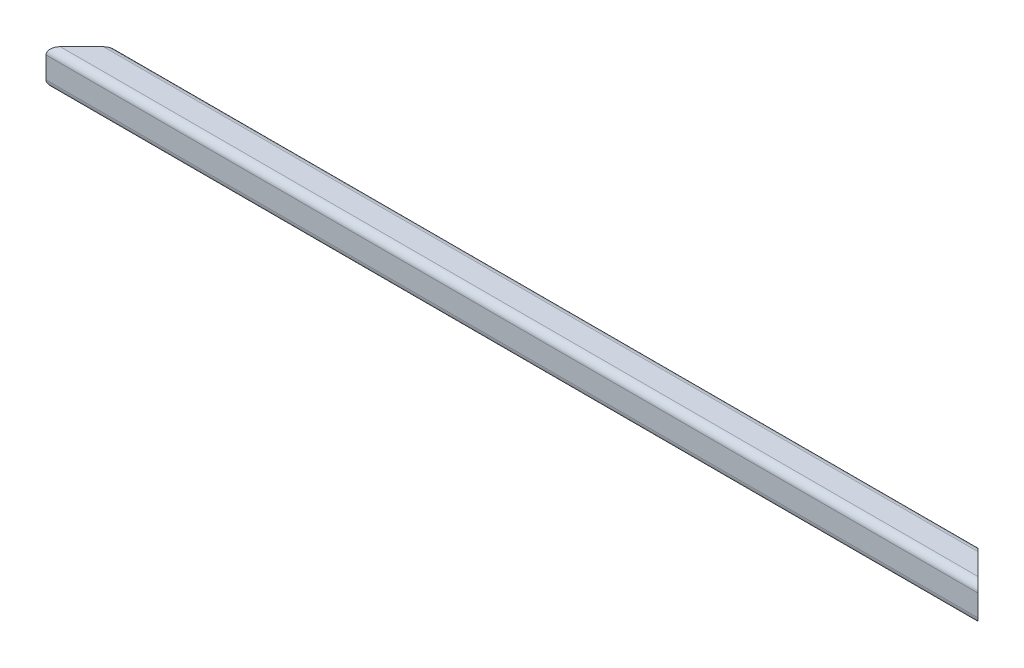
ISO-10303-21;
HEADER;
FILE_DESCRIPTION(('STEP AP214'),'2;1');
FILE_NAME('part.step','',(''),(''),'','','');
FILE_SCHEMA(('AUTOMOTIVE_DESIGN { 1 0 10303 214 1 1 1 1 }'));
ENDSEC;
DATA;
#1=APPLICATION_CONTEXT('core data for automotive mechanical design processes');
#2=APPLICATION_PROTOCOL_DEFINITION('international standard','automotive_design',2000,#1);
#3=PRODUCT_CONTEXT('',#1,'mechanical');
#4=PRODUCT('Part','Part','',(#3));
#5=PRODUCT_RELATED_PRODUCT_CATEGORY('part','',(#4));
#6=PRODUCT_DEFINITION_FORMATION('','',#4);
#7=PRODUCT_DEFINITION_CONTEXT('part definition',#1,'design');
#8=PRODUCT_DEFINITION('design','',#6,#7);
#9=PRODUCT_DEFINITION_SHAPE('','',#8);
#10=(LENGTH_UNIT() NAMED_UNIT(*) SI_UNIT(.MILLI.,.METRE.));
#11=(NAMED_UNIT(*) PLANE_ANGLE_UNIT() SI_UNIT($,.RADIAN.));
#12=(NAMED_UNIT(*) SI_UNIT($,.STERADIAN.) SOLID_ANGLE_UNIT());
#13=UNCERTAINTY_MEASURE_WITH_UNIT(LENGTH_MEASURE(1.E-05),#10,'distance_accuracy_value','');
#14=(GEOMETRIC_REPRESENTATION_CONTEXT(3) GLOBAL_UNCERTAINTY_ASSIGNED_CONTEXT((#13)) GLOBAL_UNIT_ASSIGNED_CONTEXT((#10,
#11,#12)) REPRESENTATION_CONTEXT('',''));
#15=CARTESIAN_POINT('',(0.,0.,0.));
#16=DIRECTION('',(0.,0.,1.));
#17=DIRECTION('',(1.,0.,0.));
#18=AXIS2_PLACEMENT_3D('',#15,#16,#17);
#19=CARTESIAN_POINT('',(-250.,226.,-1994.));
#20=DIRECTION('',(1.,0.,0.));
#21=DIRECTION('',(0.,0.,-1.));
#22=AXIS2_PLACEMENT_3D('',#19,#20,#21);
#23=CYLINDRICAL_SURFACE('',#22,4.);
#24=CARTESIAN_POINT('',(256.,226.,-1994.));
#25=DIRECTION('',(0.707106781186548,0.,-0.707106781186547));
#26=DIRECTION('',(0.707106781186547,0.,0.707106781186548));
#27=AXIS2_PLACEMENT_3D('',#24,#25,#26);
#28=ELLIPSE('',#27,5.65685424949238,4.);
#29=CARTESIAN_POINT('',(256.,230.,-1994.));
#30=VERTEX_POINT('',#29);
#31=CARTESIAN_POINT('',(260.,226.,-1990.));
#32=VERTEX_POINT('',#31);
#33=EDGE_CURVE('E185',#30,#32,#28,.T.);
#34=ORIENTED_EDGE('',*,*,#33,.F.);
#35=DIRECTION('',(1.,0.,0.));
#36=VECTOR('',#35,1.);
#37=CARTESIAN_POINT('',(-250.,230.,-1994.));
#38=LINE('',#37,#36);
#39=CARTESIAN_POINT('',(-256.,230.,-1994.));
#40=VERTEX_POINT('',#39);
#41=EDGE_CURVE('E265',#40,#30,#38,.T.);
#42=ORIENTED_EDGE('',*,*,#41,.F.);
#43=CARTESIAN_POINT('',(-256.,226.,-1994.));
#44=DIRECTION('',(-0.707106781186548,0.,-0.707106781186547));
#45=DIRECTION('',(0.707106781186547,0.,-0.707106781186548));
#46=AXIS2_PLACEMENT_3D('',#43,#44,#45);
#47=ELLIPSE('',#46,5.65685424949238,4.);
#48=CARTESIAN_POINT('',(-260.,226.,-1990.));
#49=VERTEX_POINT('',#48);
#50=EDGE_CURVE('E176',#49,#40,#47,.T.);
#51=ORIENTED_EDGE('',*,*,#50,.F.);
#52=DIRECTION('',(1.,0.,0.));
#53=VECTOR('',#52,1.);
#54=CARTESIAN_POINT('',(-250.,226.,-1990.));
#55=LINE('',#54,#53);
#56=EDGE_CURVE('E45',#49,#32,#55,.T.);
#57=ORIENTED_EDGE('',*,*,#56,.T.);
#58=EDGE_LOOP('',(#34,#42,#51,#57));
#59=FACE_BOUND('',#58,.T.);
#60=ADVANCED_FACE('F41',(#59),#23,.T.);
#61=CARTESIAN_POINT('',(-250.,230.,-1994.));
#62=DIRECTION('',(0.,-1.,0.));
#63=DIRECTION('',(0.,0.,-1.));
#64=AXIS2_PLACEMENT_3D('',#61,#62,#63);
#65=PLANE('',#64);
#66=DIRECTION('',(0.707106781186547,0.,0.707106781186548));
#67=VECTOR('',#66,1.);
#68=CARTESIAN_POINT('',(2.99999999999995,230.,-2247.));
#69=LINE('',#68,#67);
#70=CARTESIAN_POINT('',(244.,230.,-2006.));
#71=VERTEX_POINT('',#70);
#72=EDGE_CURVE('E182',#71,#30,#69,.T.);
#73=ORIENTED_EDGE('',*,*,#72,.F.);
#74=DIRECTION('',(1.,0.,0.));
#75=VECTOR('',#74,1.);
#76=CARTESIAN_POINT('',(-250.,230.,-2006.));
#77=LINE('',#76,#75);
#78=CARTESIAN_POINT('',(-244.,230.,-2006.));
#79=VERTEX_POINT('',#78);
#80=EDGE_CURVE('E263',#79,#71,#77,.T.);
#81=ORIENTED_EDGE('',*,*,#80,.F.);
#82=DIRECTION('',(0.707106781186547,0.,-0.707106781186548));
#83=VECTOR('',#82,1.);
#84=CARTESIAN_POINT('',(-253.,230.,-1997.));
#85=LINE('',#84,#83);
#86=EDGE_CURVE('E281',#40,#79,#85,.T.);
#87=ORIENTED_EDGE('',*,*,#86,.F.);
#88=ORIENTED_EDGE('',*,*,#41,.T.);
#89=EDGE_LOOP('',(#73,#81,#87,#88));
#90=FACE_BOUND('',#89,.T.);
#91=ADVANCED_FACE('F272',(#90),#65,.F.);
#92=CARTESIAN_POINT('',(-250.,226.,-2006.));
#93=DIRECTION('',(1.,0.,0.));
#94=DIRECTION('',(0.,0.,-1.));
#95=AXIS2_PLACEMENT_3D('',#92,#93,#94);
#96=CYLINDRICAL_SURFACE('',#95,4.);
#97=CARTESIAN_POINT('',(244.,226.,-2006.));
#98=DIRECTION('',(0.707106781186548,0.,-0.707106781186547));
#99=DIRECTION('',(0.707106781186547,0.,0.707106781186548));
#100=AXIS2_PLACEMENT_3D('',#97,#98,#99);
#101=ELLIPSE('',#100,5.65685424949238,4.);
#102=CARTESIAN_POINT('',(240.,226.,-2010.));
#103=VERTEX_POINT('',#102);
#104=EDGE_CURVE('E11',#103,#71,#101,.T.);
#105=ORIENTED_EDGE('',*,*,#104,.F.);
#106=DIRECTION('',(1.,0.,0.));
#107=VECTOR('',#106,1.);
#108=CARTESIAN_POINT('',(-250.,226.,-2010.));
#109=LINE('',#108,#107);
#110=CARTESIAN_POINT('',(-240.,226.,-2010.));
#111=VERTEX_POINT('',#110);
#112=EDGE_CURVE('E260',#111,#103,#109,.T.);
#113=ORIENTED_EDGE('',*,*,#112,.F.);
#114=CARTESIAN_POINT('',(-244.,226.,-2006.));
#115=DIRECTION('',(-0.707106781186548,0.,-0.707106781186547));
#116=DIRECTION('',(0.707106781186547,0.,-0.707106781186548));
#117=AXIS2_PLACEMENT_3D('',#114,#115,#116);
#118=ELLIPSE('',#117,5.65685424949238,4.);
#119=EDGE_CURVE('E278',#79,#111,#118,.T.);
#120=ORIENTED_EDGE('',*,*,#119,.F.);
#121=ORIENTED_EDGE('',*,*,#80,.T.);
#122=EDGE_LOOP('',(#105,#113,#120,#121));
#123=FACE_BOUND('',#122,.T.);
#124=ADVANCED_FACE('F275',(#123),#96,.T.);
#125=CARTESIAN_POINT('',(-250.,214.,-2010.));
#126=DIRECTION('',(0.,0.,1.));
#127=DIRECTION('',(1.,0.,0.));
#128=AXIS2_PLACEMENT_3D('',#125,#126,#127);
#129=PLANE('',#128);
#130=DIRECTION('',(0.,1.,0.));
#131=VECTOR('',#130,1.);
#132=CARTESIAN_POINT('',(240.,214.,-2010.));
#133=LINE('',#132,#131);
#134=CARTESIAN_POINT('',(240.,214.,-2010.));
#135=VERTEX_POINT('',#134);
#136=EDGE_CURVE('E51',#135,#103,#133,.T.);
#137=ORIENTED_EDGE('',*,*,#136,.F.);
#138=DIRECTION('',(1.,0.,0.));
#139=VECTOR('',#138,1.);
#140=CARTESIAN_POINT('',(-250.,214.,-2010.));
#141=LINE('',#140,#139);
#142=CARTESIAN_POINT('',(-240.,214.,-2010.));
#143=VERTEX_POINT('',#142);
#144=EDGE_CURVE('E257',#143,#135,#141,.T.);
#145=ORIENTED_EDGE('',*,*,#144,.F.);
#146=DIRECTION('',(0.,-1.,0.));
#147=VECTOR('',#146,1.);
#148=CARTESIAN_POINT('',(-240.,214.,-2010.));
#149=LINE('',#148,#147);
#150=EDGE_CURVE('E280',#111,#143,#149,.T.);
#151=ORIENTED_EDGE('',*,*,#150,.F.);
#152=ORIENTED_EDGE('',*,*,#112,.T.);
#153=EDGE_LOOP('',(#137,#145,#151,#152));
#154=FACE_BOUND('',#153,.T.);
#155=ADVANCED_FACE('F291',(#154),#129,.F.);
#156=CARTESIAN_POINT('',(-250.,214.,-2006.));
#157=DIRECTION('',(1.,0.,0.));
#158=DIRECTION('',(0.,0.,-1.));
#159=AXIS2_PLACEMENT_3D('',#156,#157,#158);
#160=CYLINDRICAL_SURFACE('',#159,4.);
#161=CARTESIAN_POINT('',(244.,214.,-2006.));
#162=DIRECTION('',(0.707106781186548,0.,-0.707106781186547));
#163=DIRECTION('',(0.707106781186547,0.,0.707106781186548));
#164=AXIS2_PLACEMENT_3D('',#161,#162,#163);
#165=ELLIPSE('',#164,5.65685424949238,4.);
#166=CARTESIAN_POINT('',(244.,210.,-2006.));
#167=VERTEX_POINT('',#166);
#168=EDGE_CURVE('E200',#167,#135,#165,.T.);
#169=ORIENTED_EDGE('',*,*,#168,.F.);
#170=DIRECTION('',(1.,0.,0.));
#171=VECTOR('',#170,1.);
#172=CARTESIAN_POINT('',(-250.,210.,-2006.));
#173=LINE('',#172,#171);
#174=CARTESIAN_POINT('',(-244.,210.,-2006.));
#175=VERTEX_POINT('',#174);
#176=EDGE_CURVE('E254',#175,#167,#173,.T.);
#177=ORIENTED_EDGE('',*,*,#176,.F.);
#178=CARTESIAN_POINT('',(-244.,214.,-2006.));
#179=DIRECTION('',(-0.707106781186548,0.,-0.707106781186547));
#180=DIRECTION('',(0.707106781186547,0.,-0.707106781186548));
#181=AXIS2_PLACEMENT_3D('',#178,#179,#180);
#182=ELLIPSE('',#181,5.65685424949238,4.);
#183=EDGE_CURVE('E187',#143,#175,#182,.T.);
#184=ORIENTED_EDGE('',*,*,#183,.F.);
#185=ORIENTED_EDGE('',*,*,#144,.T.);
#186=EDGE_LOOP('',(#169,#177,#184,#185));
#187=FACE_BOUND('',#186,.T.);
#188=ADVANCED_FACE('F289',(#187),#160,.T.);
#189=CARTESIAN_POINT('',(-250.,210.,-2006.));
#190=DIRECTION('',(0.,1.,0.));
#191=DIRECTION('',(0.,0.,1.));
#192=AXIS2_PLACEMENT_3D('',#189,#190,#191);
#193=PLANE('',#192);
#194=DIRECTION('',(-0.707106781186547,0.,-0.707106781186548));
#195=VECTOR('',#194,1.);
#196=CARTESIAN_POINT('',(-3.00000000000009,210.,-2253.));
#197=LINE('',#196,#195);
#198=CARTESIAN_POINT('',(256.,210.,-1994.));
#199=VERTEX_POINT('',#198);
#200=EDGE_CURVE('E203',#199,#167,#197,.T.);
#201=ORIENTED_EDGE('',*,*,#200,.F.);
#202=DIRECTION('',(1.,0.,0.));
#203=VECTOR('',#202,1.);
#204=CARTESIAN_POINT('',(-250.,210.,-1994.));
#205=LINE('',#204,#203);
#206=CARTESIAN_POINT('',(-256.,210.,-1994.));
#207=VERTEX_POINT('',#206);
#208=EDGE_CURVE('E252',#207,#199,#205,.T.);
#209=ORIENTED_EDGE('',*,*,#208,.F.);
#210=DIRECTION('',(-0.707106781186547,0.,0.707106781186548));
#211=VECTOR('',#210,1.);
#212=CARTESIAN_POINT('',(-247.,210.,-2003.));
#213=LINE('',#212,#211);
#214=EDGE_CURVE('E181',#175,#207,#213,.T.);
#215=ORIENTED_EDGE('',*,*,#214,.F.);
#216=ORIENTED_EDGE('',*,*,#176,.T.);
#217=EDGE_LOOP('',(#201,#209,#215,#216));
#218=FACE_BOUND('',#217,.T.);
#219=ADVANCED_FACE('F293',(#218),#193,.F.);
#220=CARTESIAN_POINT('',(-250.,214.,-1994.));
#221=DIRECTION('',(1.,0.,0.));
#222=DIRECTION('',(0.,0.,-1.));
#223=AXIS2_PLACEMENT_3D('',#220,#221,#222);
#224=CYLINDRICAL_SURFACE('',#223,4.);
#225=CARTESIAN_POINT('',(256.,214.,-1994.));
#226=DIRECTION('',(0.707106781186548,0.,-0.707106781186547));
#227=DIRECTION('',(0.707106781186547,0.,0.707106781186548));
#228=AXIS2_PLACEMENT_3D('',#225,#226,#227);
#229=ELLIPSE('',#228,5.65685424949238,4.);
#230=CARTESIAN_POINT('',(260.,214.,-1990.));
#231=VERTEX_POINT('',#230);
#232=EDGE_CURVE('E164',#231,#199,#229,.T.);
#233=ORIENTED_EDGE('',*,*,#232,.F.);
#234=DIRECTION('',(1.,0.,0.));
#235=VECTOR('',#234,1.);
#236=CARTESIAN_POINT('',(-250.,214.,-1990.));
#237=LINE('',#236,#235);
#238=CARTESIAN_POINT('',(-260.,214.,-1990.));
#239=VERTEX_POINT('',#238);
#240=EDGE_CURVE('E156',#239,#231,#237,.T.);
#241=ORIENTED_EDGE('',*,*,#240,.F.);
#242=CARTESIAN_POINT('',(-256.,214.,-1994.));
#243=DIRECTION('',(-0.707106781186548,0.,-0.707106781186547));
#244=DIRECTION('',(0.707106781186547,0.,-0.707106781186548));
#245=AXIS2_PLACEMENT_3D('',#242,#243,#244);
#246=ELLIPSE('',#245,5.65685424949238,4.);
#247=EDGE_CURVE('E161',#207,#239,#246,.T.);
#248=ORIENTED_EDGE('',*,*,#247,.F.);
#249=ORIENTED_EDGE('',*,*,#208,.T.);
#250=EDGE_LOOP('',(#233,#241,#248,#249));
#251=FACE_BOUND('',#250,.T.);
#252=ADVANCED_FACE('F158',(#251),#224,.T.);
#253=CARTESIAN_POINT('',(-250.,226.,-2006.));
#254=DIRECTION('',(1.,0.,0.));
#255=DIRECTION('',(0.,0.,-1.));
#256=AXIS2_PLACEMENT_3D('',#253,#254,#255);
#257=CYLINDRICAL_SURFACE('',#256,2.);
#258=DIRECTION('',(1.,0.,0.));
#259=VECTOR('',#258,1.);
#260=CARTESIAN_POINT('',(-250.,226.,-2008.));
#261=LINE('',#260,#259);
#262=CARTESIAN_POINT('',(-242.,226.,-2008.));
#263=VERTEX_POINT('',#262);
#264=CARTESIAN_POINT('',(242.,226.,-2008.));
#265=VERTEX_POINT('',#264);
#266=EDGE_CURVE('E209',#263,#265,#261,.T.);
#267=ORIENTED_EDGE('',*,*,#266,.T.);
#268=CARTESIAN_POINT('',(244.,226.,-2006.));
#269=DIRECTION('',(0.707106781186548,0.,-0.707106781186547));
#270=DIRECTION('',(0.707106781186547,0.,0.707106781186548));
#271=AXIS2_PLACEMENT_3D('',#268,#269,#270);
#272=ELLIPSE('',#271,2.82842712474619,2.);
#273=CARTESIAN_POINT('',(243.999999999999,228.,-2006.));
#274=VERTEX_POINT('',#273);
#275=EDGE_CURVE('E87',#265,#274,#272,.T.);
#276=ORIENTED_EDGE('',*,*,#275,.T.);
#277=DIRECTION('',(1.,0.,0.));
#278=VECTOR('',#277,1.);
#279=CARTESIAN_POINT('',(-250.,228.,-2006.));
#280=LINE('',#279,#278);
#281=CARTESIAN_POINT('',(-244.,228.,-2006.));
#282=VERTEX_POINT('',#281);
#283=EDGE_CURVE('E212',#282,#274,#280,.T.);
#284=ORIENTED_EDGE('',*,*,#283,.F.);
#285=CARTESIAN_POINT('',(-244.,226.,-2006.));
#286=DIRECTION('',(-0.707106781186548,0.,-0.707106781186547));
#287=DIRECTION('',(0.707106781186547,0.,-0.707106781186548));
#288=AXIS2_PLACEMENT_3D('',#285,#286,#287);
#289=ELLIPSE('',#288,2.82842712474619,2.);
#290=EDGE_CURVE('E208',#282,#263,#289,.T.);
#291=ORIENTED_EDGE('',*,*,#290,.T.);
#292=EDGE_LOOP('',(#267,#276,#284,#291));
#293=FACE_BOUND('',#292,.T.);
#294=ADVANCED_FACE('F301',(#293),#257,.F.);
#295=CARTESIAN_POINT('',(-250.,228.,-1994.));
#296=DIRECTION('',(0.,-1.,0.));
#297=DIRECTION('',(0.,0.,-1.));
#298=AXIS2_PLACEMENT_3D('',#295,#296,#297);
#299=PLANE('',#298);
#300=ORIENTED_EDGE('',*,*,#283,.T.);
#301=DIRECTION('',(0.707106781186547,0.,0.707106781186548));
#302=VECTOR('',#301,1.);
#303=CARTESIAN_POINT('',(2.99999999999995,228.,-2247.));
#304=LINE('',#303,#302);
#305=CARTESIAN_POINT('',(256.,228.,-1994.));
#306=VERTEX_POINT('',#305);
#307=EDGE_CURVE('E60',#274,#306,#304,.T.);
#308=ORIENTED_EDGE('',*,*,#307,.T.);
#309=DIRECTION('',(1.,0.,0.));
#310=VECTOR('',#309,1.);
#311=CARTESIAN_POINT('',(-250.,228.,-1994.));
#312=LINE('',#311,#310);
#313=CARTESIAN_POINT('',(-256.,228.,-1994.));
#314=VERTEX_POINT('',#313);
#315=EDGE_CURVE('E217',#314,#306,#312,.T.);
#316=ORIENTED_EDGE('',*,*,#315,.F.);
#317=DIRECTION('',(0.707106781186547,0.,-0.707106781186548));
#318=VECTOR('',#317,1.);
#319=CARTESIAN_POINT('',(-253.,228.,-1997.));
#320=LINE('',#319,#318);
#321=EDGE_CURVE('E211',#314,#282,#320,.T.);
#322=ORIENTED_EDGE('',*,*,#321,.T.);
#323=EDGE_LOOP('',(#300,#308,#316,#322));
#324=FACE_BOUND('',#323,.T.);
#325=ADVANCED_FACE('F349',(#324),#299,.T.);
#326=CARTESIAN_POINT('',(-250.,226.,-1994.));
#327=DIRECTION('',(1.,0.,0.));
#328=DIRECTION('',(0.,0.,-1.));
#329=AXIS2_PLACEMENT_3D('',#326,#327,#328);
#330=CYLINDRICAL_SURFACE('',#329,2.);
#331=ORIENTED_EDGE('',*,*,#315,.T.);
#332=CARTESIAN_POINT('',(256.,226.,-1994.));
#333=DIRECTION('',(0.707106781186548,0.,-0.707106781186547));
#334=DIRECTION('',(0.707106781186547,0.,0.707106781186548));
#335=AXIS2_PLACEMENT_3D('',#332,#333,#334);
#336=ELLIPSE('',#335,2.82842712474619,2.);
#337=CARTESIAN_POINT('',(258.,226.,-1992.));
#338=VERTEX_POINT('',#337);
#339=EDGE_CURVE('E213',#306,#338,#336,.T.);
#340=ORIENTED_EDGE('',*,*,#339,.T.);
#341=DIRECTION('',(1.,0.,0.));
#342=VECTOR('',#341,1.);
#343=CARTESIAN_POINT('',(-250.,226.,-1992.));
#344=LINE('',#343,#342);
#345=CARTESIAN_POINT('',(-258.,226.,-1992.));
#346=VERTEX_POINT('',#345);
#347=EDGE_CURVE('E222',#346,#338,#344,.T.);
#348=ORIENTED_EDGE('',*,*,#347,.F.);
#349=CARTESIAN_POINT('',(-256.,226.,-1994.));
#350=DIRECTION('',(-0.707106781186548,0.,-0.707106781186547));
#351=DIRECTION('',(0.707106781186547,0.,-0.707106781186548));
#352=AXIS2_PLACEMENT_3D('',#349,#350,#351);
#353=ELLIPSE('',#352,2.82842712474619,2.);
#354=EDGE_CURVE('E216',#346,#314,#353,.T.);
#355=ORIENTED_EDGE('',*,*,#354,.T.);
#356=EDGE_LOOP('',(#331,#340,#348,#355));
#357=FACE_BOUND('',#356,.T.);
#358=ADVANCED_FACE('F357',(#357),#330,.F.);
#359=CARTESIAN_POINT('',(-250.,226.,-1992.));
#360=DIRECTION('',(0.,0.,-1.));
#361=DIRECTION('',(-1.,0.,0.));
#362=AXIS2_PLACEMENT_3D('',#359,#360,#361);
#363=PLANE('',#362);
#364=ORIENTED_EDGE('',*,*,#347,.T.);
#365=DIRECTION('',(0.,-1.,0.));
#366=VECTOR('',#365,1.);
#367=CARTESIAN_POINT('',(258.,226.,-1992.));
#368=LINE('',#367,#366);
#369=CARTESIAN_POINT('',(258.,214.,-1992.));
#370=VERTEX_POINT('',#369);
#371=EDGE_CURVE('E218',#338,#370,#368,.T.);
#372=ORIENTED_EDGE('',*,*,#371,.T.);
#373=DIRECTION('',(1.,0.,0.));
#374=VECTOR('',#373,1.);
#375=CARTESIAN_POINT('',(-250.,214.,-1992.));
#376=LINE('',#375,#374);
#377=CARTESIAN_POINT('',(-258.,214.,-1992.));
#378=VERTEX_POINT('',#377);
#379=EDGE_CURVE('E227',#378,#370,#376,.T.);
#380=ORIENTED_EDGE('',*,*,#379,.F.);
#381=DIRECTION('',(0.,1.,0.));
#382=VECTOR('',#381,1.);
#383=CARTESIAN_POINT('',(-258.,226.,-1992.));
#384=LINE('',#383,#382);
#385=EDGE_CURVE('E221',#378,#346,#384,.T.);
#386=ORIENTED_EDGE('',*,*,#385,.T.);
#387=EDGE_LOOP('',(#364,#372,#380,#386));
#388=FACE_BOUND('',#387,.T.);
#389=ADVANCED_FACE('F365',(#388),#363,.T.);
#390=CARTESIAN_POINT('',(-250.,214.,-1994.));
#391=DIRECTION('',(1.,0.,0.));
#392=DIRECTION('',(0.,0.,-1.));
#393=AXIS2_PLACEMENT_3D('',#390,#391,#392);
#394=CYLINDRICAL_SURFACE('',#393,2.);
#395=ORIENTED_EDGE('',*,*,#379,.T.);
#396=CARTESIAN_POINT('',(256.,214.,-1994.));
#397=DIRECTION('',(0.707106781186548,0.,-0.707106781186547));
#398=DIRECTION('',(0.707106781186547,0.,0.707106781186548));
#399=AXIS2_PLACEMENT_3D('',#396,#397,#398);
#400=ELLIPSE('',#399,2.82842712474619,2.);
#401=CARTESIAN_POINT('',(256.,212.,-1994.));
#402=VERTEX_POINT('',#401);
#403=EDGE_CURVE('E223',#370,#402,#400,.T.);
#404=ORIENTED_EDGE('',*,*,#403,.T.);
#405=DIRECTION('',(1.,0.,0.));
#406=VECTOR('',#405,1.);
#407=CARTESIAN_POINT('',(-250.,212.,-1994.));
#408=LINE('',#407,#406);
#409=CARTESIAN_POINT('',(-256.,212.,-1994.));
#410=VERTEX_POINT('',#409);
#411=EDGE_CURVE('E232',#410,#402,#408,.T.);
#412=ORIENTED_EDGE('',*,*,#411,.F.);
#413=CARTESIAN_POINT('',(-256.,214.,-1994.));
#414=DIRECTION('',(-0.707106781186548,0.,-0.707106781186547));
#415=DIRECTION('',(0.707106781186547,0.,-0.707106781186548));
#416=AXIS2_PLACEMENT_3D('',#413,#414,#415);
#417=ELLIPSE('',#416,2.82842712474619,2.);
#418=EDGE_CURVE('E226',#410,#378,#417,.T.);
#419=ORIENTED_EDGE('',*,*,#418,.T.);
#420=EDGE_LOOP('',(#395,#404,#412,#419));
#421=FACE_BOUND('',#420,.T.);
#422=ADVANCED_FACE('F373',(#421),#394,.F.);
#423=CARTESIAN_POINT('',(-250.,212.,-2006.));
#424=DIRECTION('',(0.,1.,0.));
#425=DIRECTION('',(0.,0.,1.));
#426=AXIS2_PLACEMENT_3D('',#423,#424,#425);
#427=PLANE('',#426);
#428=ORIENTED_EDGE('',*,*,#411,.T.);
#429=DIRECTION('',(-0.707106781186547,0.,-0.707106781186548));
#430=VECTOR('',#429,1.);
#431=CARTESIAN_POINT('',(-3.00000000000009,212.,-2253.));
#432=LINE('',#431,#430);
#433=CARTESIAN_POINT('',(244.,212.,-2006.));
#434=VERTEX_POINT('',#433);
#435=EDGE_CURVE('E228',#402,#434,#432,.T.);
#436=ORIENTED_EDGE('',*,*,#435,.T.);
#437=DIRECTION('',(1.,0.,0.));
#438=VECTOR('',#437,1.);
#439=CARTESIAN_POINT('',(-250.,212.,-2006.));
#440=LINE('',#439,#438);
#441=CARTESIAN_POINT('',(-244.,212.,-2006.));
#442=VERTEX_POINT('',#441);
#443=EDGE_CURVE('E236',#442,#434,#440,.T.);
#444=ORIENTED_EDGE('',*,*,#443,.F.);
#445=DIRECTION('',(-0.707106781186547,0.,0.707106781186548));
#446=VECTOR('',#445,1.);
#447=CARTESIAN_POINT('',(-247.,212.,-2003.));
#448=LINE('',#447,#446);
#449=EDGE_CURVE('E231',#442,#410,#448,.T.);
#450=ORIENTED_EDGE('',*,*,#449,.T.);
#451=EDGE_LOOP('',(#428,#436,#444,#450));
#452=FACE_BOUND('',#451,.T.);
#453=ADVANCED_FACE('F381',(#452),#427,.T.);
#454=CARTESIAN_POINT('',(-250.,214.,-2006.));
#455=DIRECTION('',(1.,0.,0.));
#456=DIRECTION('',(0.,0.,-1.));
#457=AXIS2_PLACEMENT_3D('',#454,#455,#456);
#458=CYLINDRICAL_SURFACE('',#457,2.);
#459=ORIENTED_EDGE('',*,*,#443,.T.);
#460=CARTESIAN_POINT('',(244.,214.,-2006.));
#461=DIRECTION('',(0.707106781186548,0.,-0.707106781186547));
#462=DIRECTION('',(0.707106781186547,0.,0.707106781186548));
#463=AXIS2_PLACEMENT_3D('',#460,#461,#462);
#464=ELLIPSE('',#463,2.82842712474619,2.);
#465=CARTESIAN_POINT('',(242.,214.,-2008.));
#466=VERTEX_POINT('',#465);
#467=EDGE_CURVE('E233',#434,#466,#464,.T.);
#468=ORIENTED_EDGE('',*,*,#467,.T.);
#469=DIRECTION('',(1.,0.,0.));
#470=VECTOR('',#469,1.);
#471=CARTESIAN_POINT('',(-250.,214.,-2008.));
#472=LINE('',#471,#470);
#473=CARTESIAN_POINT('',(-242.,214.,-2008.));
#474=VERTEX_POINT('',#473);
#475=EDGE_CURVE('E194',#474,#466,#472,.T.);
#476=ORIENTED_EDGE('',*,*,#475,.F.);
#477=CARTESIAN_POINT('',(-244.,214.,-2006.));
#478=DIRECTION('',(-0.707106781186548,0.,-0.707106781186547));
#479=DIRECTION('',(0.707106781186547,0.,-0.707106781186548));
#480=AXIS2_PLACEMENT_3D('',#477,#478,#479);
#481=ELLIPSE('',#480,2.82842712474619,2.);
#482=EDGE_CURVE('E235',#474,#442,#481,.T.);
#483=ORIENTED_EDGE('',*,*,#482,.T.);
#484=EDGE_LOOP('',(#459,#468,#476,#483));
#485=FACE_BOUND('',#484,.T.);
#486=ADVANCED_FACE('F389',(#485),#458,.F.);
#487=CARTESIAN_POINT('',(-250.,214.,-2008.));
#488=DIRECTION('',(0.,0.,1.));
#489=DIRECTION('',(1.,0.,0.));
#490=AXIS2_PLACEMENT_3D('',#487,#488,#489);
#491=PLANE('',#490);
#492=ORIENTED_EDGE('',*,*,#475,.T.);
#493=DIRECTION('',(0.,1.,0.));
#494=VECTOR('',#493,1.);
#495=CARTESIAN_POINT('',(242.,214.,-2008.));
#496=LINE('',#495,#494);
#497=EDGE_CURVE('E82',#466,#265,#496,.T.);
#498=ORIENTED_EDGE('',*,*,#497,.T.);
#499=ORIENTED_EDGE('',*,*,#266,.F.);
#500=DIRECTION('',(0.,-1.,0.));
#501=VECTOR('',#500,1.);
#502=CARTESIAN_POINT('',(-242.,214.,-2008.));
#503=LINE('',#502,#501);
#504=EDGE_CURVE('E169',#263,#474,#503,.T.);
#505=ORIENTED_EDGE('',*,*,#504,.T.);
#506=EDGE_LOOP('',(#492,#498,#499,#505));
#507=FACE_BOUND('',#506,.T.);
#508=ADVANCED_FACE('F397',(#507),#491,.T.);
#509=CARTESIAN_POINT('',(-250.,226.,-1990.));
#510=DIRECTION('',(0.,0.,-1.));
#511=DIRECTION('',(-1.,0.,0.));
#512=AXIS2_PLACEMENT_3D('',#509,#510,#511);
#513=PLANE('',#512);
#514=DIRECTION('',(0.,-1.,0.));
#515=VECTOR('',#514,1.);
#516=CARTESIAN_POINT('',(260.,226.,-1990.));
#517=LINE('',#516,#515);
#518=EDGE_CURVE('E196',#32,#231,#517,.T.);
#519=ORIENTED_EDGE('',*,*,#518,.F.);
#520=ORIENTED_EDGE('',*,*,#56,.F.);
#521=DIRECTION('',(0.,1.,0.));
#522=VECTOR('',#521,1.);
#523=CARTESIAN_POINT('',(-260.,226.,-1990.));
#524=LINE('',#523,#522);
#525=EDGE_CURVE('E168',#239,#49,#524,.T.);
#526=ORIENTED_EDGE('',*,*,#525,.F.);
#527=ORIENTED_EDGE('',*,*,#240,.T.);
#528=EDGE_LOOP('',(#519,#520,#526,#527));
#529=FACE_BOUND('',#528,.T.);
#530=ADVANCED_FACE('F172',(#529),#513,.F.);
#531=CARTESIAN_POINT('',(-250.,220.,-2000.));
#532=DIRECTION('',(-0.707106781186548,0.,-0.707106781186547));
#533=DIRECTION('',(-0.707106781186547,0.,0.707106781186548));
#534=AXIS2_PLACEMENT_3D('',#531,#532,#533);
#535=PLANE('',#534);
#536=ORIENTED_EDGE('',*,*,#290,.F.);
#537=ORIENTED_EDGE('',*,*,#321,.F.);
#538=ORIENTED_EDGE('',*,*,#354,.F.);
#539=ORIENTED_EDGE('',*,*,#385,.F.);
#540=ORIENTED_EDGE('',*,*,#418,.F.);
#541=ORIENTED_EDGE('',*,*,#449,.F.);
#542=ORIENTED_EDGE('',*,*,#482,.F.);
#543=ORIENTED_EDGE('',*,*,#504,.F.);
#544=EDGE_LOOP('',(#536,#537,#538,#539,#540,#541,#542,#543));
#545=FACE_BOUND('',#544,.T.);
#546=ORIENTED_EDGE('',*,*,#525,.T.);
#547=ORIENTED_EDGE('',*,*,#50,.T.);
#548=ORIENTED_EDGE('',*,*,#86,.T.);
#549=ORIENTED_EDGE('',*,*,#119,.T.);
#550=ORIENTED_EDGE('',*,*,#150,.T.);
#551=ORIENTED_EDGE('',*,*,#183,.T.);
#552=ORIENTED_EDGE('',*,*,#214,.T.);
#553=ORIENTED_EDGE('',*,*,#247,.T.);
#554=EDGE_LOOP('',(#546,#547,#548,#549,#550,#551,#552,#553));
#555=FACE_BOUND('',#554,.T.);
#556=ADVANCED_FACE('F179',(#545,#555),#535,.T.);
#557=CARTESIAN_POINT('',(250.,220.,-2000.));
#558=DIRECTION('',(0.707106781186548,0.,-0.707106781186547));
#559=DIRECTION('',(-0.707106781186547,0.,-0.707106781186548));
#560=AXIS2_PLACEMENT_3D('',#557,#558,#559);
#561=PLANE('',#560);
#562=ORIENTED_EDGE('',*,*,#275,.F.);
#563=ORIENTED_EDGE('',*,*,#497,.F.);
#564=ORIENTED_EDGE('',*,*,#467,.F.);
#565=ORIENTED_EDGE('',*,*,#435,.F.);
#566=ORIENTED_EDGE('',*,*,#403,.F.);
#567=ORIENTED_EDGE('',*,*,#371,.F.);
#568=ORIENTED_EDGE('',*,*,#339,.F.);
#569=ORIENTED_EDGE('',*,*,#307,.F.);
#570=EDGE_LOOP('',(#562,#563,#564,#565,#566,#567,#568,#569));
#571=FACE_BOUND('',#570,.T.);
#572=ORIENTED_EDGE('',*,*,#72,.T.);
#573=ORIENTED_EDGE('',*,*,#33,.T.);
#574=ORIENTED_EDGE('',*,*,#518,.T.);
#575=ORIENTED_EDGE('',*,*,#232,.T.);
#576=ORIENTED_EDGE('',*,*,#200,.T.);
#577=ORIENTED_EDGE('',*,*,#168,.T.);
#578=ORIENTED_EDGE('',*,*,#136,.T.);
#579=ORIENTED_EDGE('',*,*,#104,.T.);
#580=EDGE_LOOP('',(#572,#573,#574,#575,#576,#577,#578,#579));
#581=FACE_BOUND('',#580,.T.);
#582=ADVANCED_FACE('F43',(#571,#581),#561,.T.);
#583=CLOSED_SHELL('',(#60,#91,#124,#155,#188,#219,#252,#294,#325,#358,#389,#422,#453,#486,#508,
#530,#556,#582));
#584=MANIFOLD_SOLID_BREP('B2',#583);
#585=ADVANCED_BREP_SHAPE_REPRESENTATION('',(#18,#584),#14);
#586=SHAPE_DEFINITION_REPRESENTATION(#9,#585);
ENDSEC;
END-ISO-10303-21;
